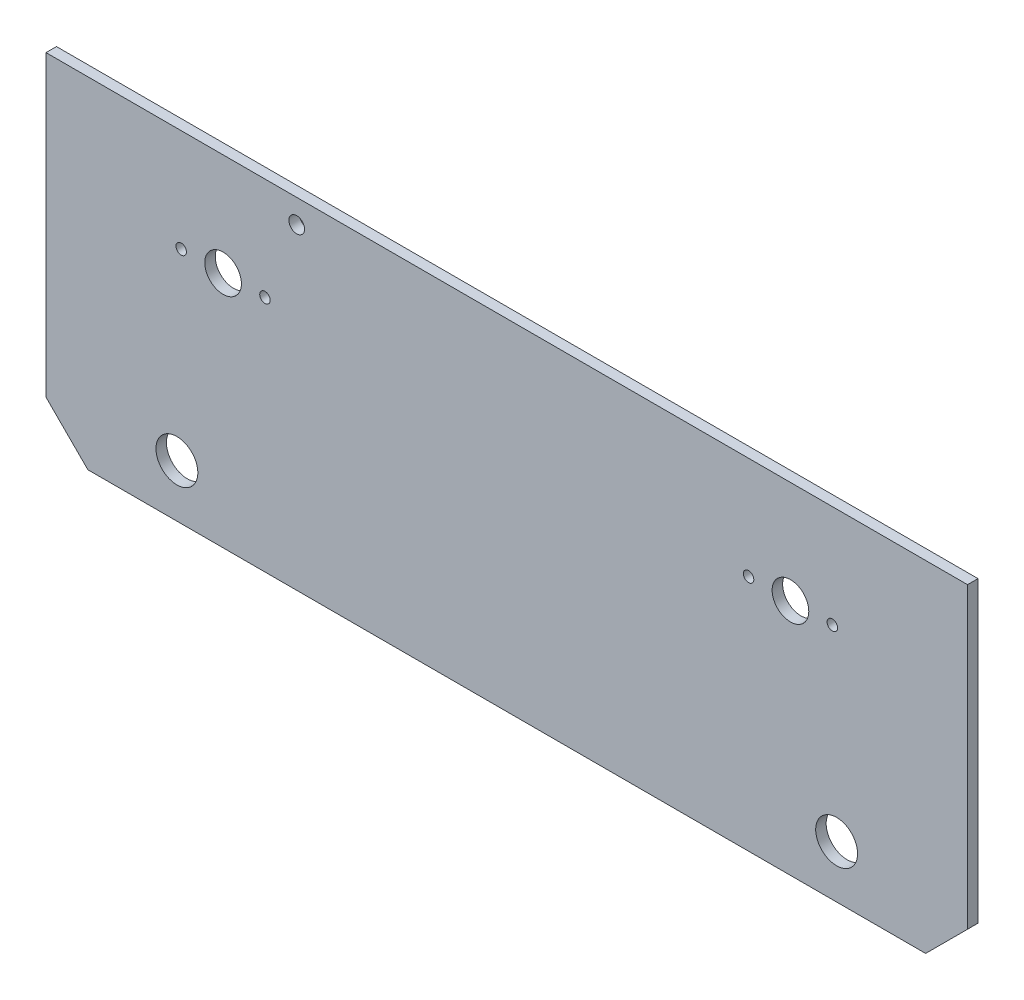
ISO-10303-21;
HEADER;
FILE_DESCRIPTION(('STEP AP214'),'2;1');
FILE_NAME('part.step','',(''),(''),'','','');
FILE_SCHEMA(('AUTOMOTIVE_DESIGN { 1 0 10303 214 1 1 1 1 }'));
ENDSEC;
DATA;
#1=APPLICATION_CONTEXT('core data for automotive mechanical design processes');
#2=APPLICATION_PROTOCOL_DEFINITION('international standard','automotive_design',2000,#1);
#3=PRODUCT_CONTEXT('',#1,'mechanical');
#4=PRODUCT('Part','Part','',(#3));
#5=PRODUCT_RELATED_PRODUCT_CATEGORY('part','',(#4));
#6=PRODUCT_DEFINITION_FORMATION('','',#4);
#7=PRODUCT_DEFINITION_CONTEXT('part definition',#1,'design');
#8=PRODUCT_DEFINITION('design','',#6,#7);
#9=PRODUCT_DEFINITION_SHAPE('','',#8);
#10=(LENGTH_UNIT() NAMED_UNIT(*) SI_UNIT(.MILLI.,.METRE.));
#11=(NAMED_UNIT(*) PLANE_ANGLE_UNIT() SI_UNIT($,.RADIAN.));
#12=(NAMED_UNIT(*) SI_UNIT($,.STERADIAN.) SOLID_ANGLE_UNIT());
#13=UNCERTAINTY_MEASURE_WITH_UNIT(LENGTH_MEASURE(1.E-05),#10,'distance_accuracy_value','');
#14=(GEOMETRIC_REPRESENTATION_CONTEXT(3) GLOBAL_UNCERTAINTY_ASSIGNED_CONTEXT((#13)) GLOBAL_UNIT_ASSIGNED_CONTEXT((#10,
#11,#12)) REPRESENTATION_CONTEXT('',''));
#15=CARTESIAN_POINT('',(0.,0.,0.));
#16=DIRECTION('',(0.,0.,1.));
#17=DIRECTION('',(1.,0.,0.));
#18=AXIS2_PLACEMENT_3D('',#15,#16,#17);
#19=CARTESIAN_POINT('',(40.11537857854,-145.444231825265,2.));
#20=DIRECTION('',(0.,0.,1.));
#21=DIRECTION('',(1.,0.,0.));
#22=AXIS2_PLACEMENT_3D('',#19,#20,#21);
#23=PLANE('',#22);
#24=CARTESIAN_POINT('',(0.,30.1478303680369,2.));
#25=DIRECTION('',(0.,0.,1.));
#26=DIRECTION('',(1.,0.,0.));
#27=AXIS2_PLACEMENT_3D('',#24,#25,#26);
#28=CIRCLE('',#27,1.5);
#29=CARTESIAN_POINT('',(1.5,30.1478303680369,2.));
#30=VERTEX_POINT('',#29);
#31=EDGE_CURVE('E179',#30,#30,#28,.T.);
#32=ORIENTED_EDGE('',*,*,#31,.F.);
#33=EDGE_LOOP('',(#32));
#34=FACE_BOUND('',#33,.T.);
#35=CARTESIAN_POINT('',(86.2953785785399,15.0982378333792,2.));
#36=DIRECTION('',(0.,0.,-1.));
#37=DIRECTION('',(-1.,0.,0.));
#38=AXIS2_PLACEMENT_3D('',#35,#36,#37);
#39=CIRCLE('',#38,0.999999999999985);
#40=CARTESIAN_POINT('',(85.2953785785399,15.0982378333792,2.));
#41=VERTEX_POINT('',#40);
#42=EDGE_CURVE('E159',#41,#41,#39,.T.);
#43=ORIENTED_EDGE('',*,*,#42,.T.);
#44=EDGE_LOOP('',(#43));
#45=FACE_BOUND('',#44,.T.);
#46=CARTESIAN_POINT('',(-6.06462142146009,15.0982378333792,2.));
#47=DIRECTION('',(0.,0.,1.));
#48=DIRECTION('',(1.,0.,0.));
#49=AXIS2_PLACEMENT_3D('',#46,#47,#48);
#50=CIRCLE('',#49,1.);
#51=CARTESIAN_POINT('',(-5.06462142146009,15.0982378333792,2.));
#52=VERTEX_POINT('',#51);
#53=EDGE_CURVE('E153',#52,#52,#50,.T.);
#54=ORIENTED_EDGE('',*,*,#53,.F.);
#55=EDGE_LOOP('',(#54));
#56=FACE_BOUND('',#55,.T.);
#57=CARTESIAN_POINT('',(-22.0646214214601,15.0982378333791,2.));
#58=DIRECTION('',(0.,0.,1.));
#59=DIRECTION('',(1.,0.,0.));
#60=AXIS2_PLACEMENT_3D('',#57,#58,#59);
#61=CIRCLE('',#60,1.);
#62=CARTESIAN_POINT('',(-21.0646214214601,15.0982378333791,2.));
#63=VERTEX_POINT('',#62);
#64=EDGE_CURVE('E147',#63,#63,#61,.T.);
#65=ORIENTED_EDGE('',*,*,#64,.F.);
#66=EDGE_LOOP('',(#65));
#67=FACE_BOUND('',#66,.T.);
#68=CARTESIAN_POINT('',(-14.0646214214601,15.0982378333792,2.));
#69=DIRECTION('',(0.,0.,1.));
#70=DIRECTION('',(1.,0.,0.));
#71=AXIS2_PLACEMENT_3D('',#68,#69,#70);
#72=CIRCLE('',#71,3.5);
#73=CARTESIAN_POINT('',(-10.5646214214601,15.0982378333792,2.));
#74=VERTEX_POINT('',#73);
#75=EDGE_CURVE('E144',#74,#74,#72,.T.);
#76=ORIENTED_EDGE('',*,*,#75,.F.);
#77=EDGE_LOOP('',(#76));
#78=FACE_BOUND('',#77,.T.);
#79=DIRECTION('',(-0.707106781186551,0.707106781186544,0.));
#80=VECTOR('',#79,1.);
#81=CARTESIAN_POINT('',(57.6759776372402,-127.883632766565,2.));
#82=LINE('',#81,#80);
#83=CARTESIAN_POINT('',(-39.8846214214601,-30.3230337078652,2.));
#84=VERTEX_POINT('',#83);
#85=CARTESIAN_POINT('',(-47.8846214214601,-22.3230337078653,2.));
#86=VERTEX_POINT('',#85);
#87=EDGE_CURVE('E125',#84,#86,#82,.T.);
#88=ORIENTED_EDGE('',*,*,#87,.F.);
#89=DIRECTION('',(1.,0.,0.));
#90=VECTOR('',#89,1.);
#91=CARTESIAN_POINT('',(40.11537857854,-30.3230337078652,2.));
#92=LINE('',#91,#90);
#93=CARTESIAN_POINT('',(120.11537857854,-30.3230337078652,2.));
#94=VERTEX_POINT('',#93);
#95=EDGE_CURVE('E140',#84,#94,#92,.T.);
#96=ORIENTED_EDGE('',*,*,#95,.T.);
#97=DIRECTION('',(0.70710678118655,0.707106781186545,0.));
#98=VECTOR('',#97,1.);
#99=CARTESIAN_POINT('',(22.5547795198397,-127.883632766565,2.));
#100=LINE('',#99,#98);
#101=CARTESIAN_POINT('',(128.11537857854,-22.3230337078652,2.));
#102=VERTEX_POINT('',#101);
#103=EDGE_CURVE('E91',#94,#102,#100,.T.);
#104=ORIENTED_EDGE('',*,*,#103,.T.);
#105=DIRECTION('',(0.,-1.,0.));
#106=VECTOR('',#105,1.);
#107=CARTESIAN_POINT('',(128.11537857854,-145.444231825265,2.));
#108=LINE('',#107,#106);
#109=CARTESIAN_POINT('',(128.11537857854,34.6769662921348,2.));
#110=VERTEX_POINT('',#109);
#111=EDGE_CURVE('E79',#110,#102,#108,.T.);
#112=ORIENTED_EDGE('',*,*,#111,.F.);
#113=DIRECTION('',(1.,0.,0.));
#114=VECTOR('',#113,1.);
#115=CARTESIAN_POINT('',(40.11537857854,34.6769662921348,2.));
#116=LINE('',#115,#114);
#117=CARTESIAN_POINT('',(-47.8846214214601,34.6769662921348,2.));
#118=VERTEX_POINT('',#117);
#119=EDGE_CURVE('E89',#118,#110,#116,.T.);
#120=ORIENTED_EDGE('',*,*,#119,.F.);
#121=DIRECTION('',(0.,-1.,0.));
#122=VECTOR('',#121,1.);
#123=CARTESIAN_POINT('',(-47.8846214214601,-145.444231825265,2.));
#124=LINE('',#123,#122);
#125=EDGE_CURVE('E34',#118,#86,#124,.T.);
#126=ORIENTED_EDGE('',*,*,#125,.T.);
#127=EDGE_LOOP('',(#88,#96,#104,#112,#120,#126));
#128=FACE_BOUND('',#127,.T.);
#129=CARTESIAN_POINT('',(-22.8846214214601,-20.3230337078652,2.));
#130=DIRECTION('',(0.,0.,1.));
#131=DIRECTION('',(1.,0.,0.));
#132=AXIS2_PLACEMENT_3D('',#129,#130,#131);
#133=CIRCLE('',#132,4.);
#134=CARTESIAN_POINT('',(-18.8846214214601,-20.3230337078652,2.));
#135=VERTEX_POINT('',#134);
#136=EDGE_CURVE('E96',#135,#135,#133,.T.);
#137=ORIENTED_EDGE('',*,*,#136,.F.);
#138=EDGE_LOOP('',(#137));
#139=FACE_BOUND('',#138,.T.);
#140=CARTESIAN_POINT('',(103.11537857854,-20.3230337078652,2.));
#141=DIRECTION('',(0.,0.,1.));
#142=DIRECTION('',(1.,0.,0.));
#143=AXIS2_PLACEMENT_3D('',#140,#141,#142);
#144=CIRCLE('',#143,4.);
#145=CARTESIAN_POINT('',(107.11537857854,-20.3230337078652,2.));
#146=VERTEX_POINT('',#145);
#147=EDGE_CURVE('E102',#146,#146,#144,.T.);
#148=ORIENTED_EDGE('',*,*,#147,.F.);
#149=EDGE_LOOP('',(#148));
#150=FACE_BOUND('',#149,.T.);
#151=CARTESIAN_POINT('',(94.29537857854,15.0982378333791,2.));
#152=DIRECTION('',(0.,0.,1.));
#153=DIRECTION('',(1.,0.,0.));
#154=AXIS2_PLACEMENT_3D('',#151,#152,#153);
#155=CIRCLE('',#154,3.5);
#156=CARTESIAN_POINT('',(97.79537857854,15.0982378333791,2.));
#157=VERTEX_POINT('',#156);
#158=EDGE_CURVE('E165',#157,#157,#155,.T.);
#159=ORIENTED_EDGE('',*,*,#158,.F.);
#160=EDGE_LOOP('',(#159));
#161=FACE_BOUND('',#160,.T.);
#162=CARTESIAN_POINT('',(102.29537857854,15.0982378333791,2.));
#163=DIRECTION('',(0.,0.,-1.));
#164=DIRECTION('',(-1.,0.,0.));
#165=AXIS2_PLACEMENT_3D('',#162,#163,#164);
#166=CIRCLE('',#165,1.00000000000001);
#167=CARTESIAN_POINT('',(101.29537857854,15.0982378333791,2.));
#168=VERTEX_POINT('',#167);
#169=EDGE_CURVE('E171',#168,#168,#166,.T.);
#170=ORIENTED_EDGE('',*,*,#169,.T.);
#171=EDGE_LOOP('',(#170));
#172=FACE_BOUND('',#171,.T.);
#173=ADVANCED_FACE('F16',(#34,#45,#56,#67,#78,#128,#139,#150,#161,#172),#23,.T.);
#174=CARTESIAN_POINT('',(40.11537857854,-145.444231825265,0.));
#175=DIRECTION('',(0.,0.,1.));
#176=DIRECTION('',(1.,0.,0.));
#177=AXIS2_PLACEMENT_3D('',#174,#175,#176);
#178=PLANE('',#177);
#179=CARTESIAN_POINT('',(0.,30.1478303680369,0.));
#180=DIRECTION('',(0.,0.,1.));
#181=DIRECTION('',(1.,0.,0.));
#182=AXIS2_PLACEMENT_3D('',#179,#180,#181);
#183=CIRCLE('',#182,1.5);
#184=CARTESIAN_POINT('',(1.5,30.1478303680369,0.));
#185=VERTEX_POINT('',#184);
#186=EDGE_CURVE('E20',#185,#185,#183,.T.);
#187=ORIENTED_EDGE('',*,*,#186,.T.);
#188=EDGE_LOOP('',(#187));
#189=FACE_BOUND('',#188,.T.);
#190=CARTESIAN_POINT('',(86.2953785785399,15.0982378333792,0.));
#191=DIRECTION('',(0.,0.,-1.));
#192=DIRECTION('',(-1.,0.,0.));
#193=AXIS2_PLACEMENT_3D('',#190,#191,#192);
#194=CIRCLE('',#193,0.999999999999985);
#195=CARTESIAN_POINT('',(85.2953785785399,15.0982378333792,0.));
#196=VERTEX_POINT('',#195);
#197=EDGE_CURVE('E162',#196,#196,#194,.T.);
#198=ORIENTED_EDGE('',*,*,#197,.F.);
#199=EDGE_LOOP('',(#198));
#200=FACE_BOUND('',#199,.T.);
#201=CARTESIAN_POINT('',(-6.06462142146009,15.0982378333792,0.));
#202=DIRECTION('',(0.,0.,1.));
#203=DIRECTION('',(1.,0.,0.));
#204=AXIS2_PLACEMENT_3D('',#201,#202,#203);
#205=CIRCLE('',#204,1.);
#206=CARTESIAN_POINT('',(-5.06462142146009,15.0982378333792,0.));
#207=VERTEX_POINT('',#206);
#208=EDGE_CURVE('E156',#207,#207,#205,.T.);
#209=ORIENTED_EDGE('',*,*,#208,.T.);
#210=EDGE_LOOP('',(#209));
#211=FACE_BOUND('',#210,.T.);
#212=CARTESIAN_POINT('',(-22.0646214214601,15.0982378333791,0.));
#213=DIRECTION('',(0.,0.,1.));
#214=DIRECTION('',(1.,0.,0.));
#215=AXIS2_PLACEMENT_3D('',#212,#213,#214);
#216=CIRCLE('',#215,1.);
#217=CARTESIAN_POINT('',(-21.0646214214601,15.0982378333791,0.));
#218=VERTEX_POINT('',#217);
#219=EDGE_CURVE('E150',#218,#218,#216,.T.);
#220=ORIENTED_EDGE('',*,*,#219,.T.);
#221=EDGE_LOOP('',(#220));
#222=FACE_BOUND('',#221,.T.);
#223=CARTESIAN_POINT('',(-14.0646214214601,15.0982378333792,0.));
#224=DIRECTION('',(0.,0.,1.));
#225=DIRECTION('',(1.,0.,0.));
#226=AXIS2_PLACEMENT_3D('',#223,#224,#225);
#227=CIRCLE('',#226,3.5);
#228=CARTESIAN_POINT('',(-10.5646214214601,15.0982378333792,0.));
#229=VERTEX_POINT('',#228);
#230=EDGE_CURVE('E109',#229,#229,#227,.T.);
#231=ORIENTED_EDGE('',*,*,#230,.T.);
#232=EDGE_LOOP('',(#231));
#233=FACE_BOUND('',#232,.T.);
#234=DIRECTION('',(-0.707106781186551,0.707106781186544,0.));
#235=VECTOR('',#234,1.);
#236=CARTESIAN_POINT('',(57.6759776372402,-127.883632766565,0.));
#237=LINE('',#236,#235);
#238=CARTESIAN_POINT('',(-39.8846214214601,-30.3230337078652,0.));
#239=VERTEX_POINT('',#238);
#240=CARTESIAN_POINT('',(-47.8846214214601,-22.3230337078653,0.));
#241=VERTEX_POINT('',#240);
#242=EDGE_CURVE('E105',#239,#241,#237,.T.);
#243=ORIENTED_EDGE('',*,*,#242,.T.);
#244=DIRECTION('',(0.,-1.,0.));
#245=VECTOR('',#244,1.);
#246=CARTESIAN_POINT('',(-47.8846214214601,-145.444231825265,0.));
#247=LINE('',#246,#245);
#248=CARTESIAN_POINT('',(-47.8846214214601,34.6769662921348,0.));
#249=VERTEX_POINT('',#248);
#250=EDGE_CURVE('E117',#249,#241,#247,.T.);
#251=ORIENTED_EDGE('',*,*,#250,.F.);
#252=DIRECTION('',(1.,0.,0.));
#253=VECTOR('',#252,1.);
#254=CARTESIAN_POINT('',(40.11537857854,34.6769662921348,0.));
#255=LINE('',#254,#253);
#256=CARTESIAN_POINT('',(128.11537857854,34.6769662921348,0.));
#257=VERTEX_POINT('',#256);
#258=EDGE_CURVE('E115',#249,#257,#255,.T.);
#259=ORIENTED_EDGE('',*,*,#258,.T.);
#260=DIRECTION('',(0.,-1.,0.));
#261=VECTOR('',#260,1.);
#262=CARTESIAN_POINT('',(128.11537857854,-145.444231825265,0.));
#263=LINE('',#262,#261);
#264=CARTESIAN_POINT('',(128.11537857854,-22.3230337078652,0.));
#265=VERTEX_POINT('',#264);
#266=EDGE_CURVE('E81',#257,#265,#263,.T.);
#267=ORIENTED_EDGE('',*,*,#266,.T.);
#268=DIRECTION('',(0.70710678118655,0.707106781186545,0.));
#269=VECTOR('',#268,1.);
#270=CARTESIAN_POINT('',(22.5547795198397,-127.883632766565,0.));
#271=LINE('',#270,#269);
#272=CARTESIAN_POINT('',(120.11537857854,-30.3230337078652,0.));
#273=VERTEX_POINT('',#272);
#274=EDGE_CURVE('E111',#273,#265,#271,.T.);
#275=ORIENTED_EDGE('',*,*,#274,.F.);
#276=DIRECTION('',(1.,0.,0.));
#277=VECTOR('',#276,1.);
#278=CARTESIAN_POINT('',(40.11537857854,-30.3230337078652,0.));
#279=LINE('',#278,#277);
#280=EDGE_CURVE('E108',#239,#273,#279,.T.);
#281=ORIENTED_EDGE('',*,*,#280,.F.);
#282=EDGE_LOOP('',(#243,#251,#259,#267,#275,#281));
#283=FACE_BOUND('',#282,.T.);
#284=CARTESIAN_POINT('',(-22.8846214214601,-20.3230337078652,0.));
#285=DIRECTION('',(0.,0.,1.));
#286=DIRECTION('',(1.,0.,0.));
#287=AXIS2_PLACEMENT_3D('',#284,#285,#286);
#288=CIRCLE('',#287,4.);
#289=CARTESIAN_POINT('',(-18.8846214214601,-20.3230337078652,0.));
#290=VERTEX_POINT('',#289);
#291=EDGE_CURVE('E119',#290,#290,#288,.T.);
#292=ORIENTED_EDGE('',*,*,#291,.T.);
#293=EDGE_LOOP('',(#292));
#294=FACE_BOUND('',#293,.T.);
#295=CARTESIAN_POINT('',(103.11537857854,-20.3230337078652,0.));
#296=DIRECTION('',(0.,0.,1.));
#297=DIRECTION('',(1.,0.,0.));
#298=AXIS2_PLACEMENT_3D('',#295,#296,#297);
#299=CIRCLE('',#298,4.);
#300=CARTESIAN_POINT('',(107.11537857854,-20.3230337078652,0.));
#301=VERTEX_POINT('',#300);
#302=EDGE_CURVE('E122',#301,#301,#299,.T.);
#303=ORIENTED_EDGE('',*,*,#302,.T.);
#304=EDGE_LOOP('',(#303));
#305=FACE_BOUND('',#304,.T.);
#306=CARTESIAN_POINT('',(94.29537857854,15.0982378333791,0.));
#307=DIRECTION('',(0.,0.,1.));
#308=DIRECTION('',(1.,0.,0.));
#309=AXIS2_PLACEMENT_3D('',#306,#307,#308);
#310=CIRCLE('',#309,3.5);
#311=CARTESIAN_POINT('',(97.79537857854,15.0982378333791,0.));
#312=VERTEX_POINT('',#311);
#313=EDGE_CURVE('E168',#312,#312,#310,.T.);
#314=ORIENTED_EDGE('',*,*,#313,.T.);
#315=EDGE_LOOP('',(#314));
#316=FACE_BOUND('',#315,.T.);
#317=CARTESIAN_POINT('',(102.29537857854,15.0982378333791,0.));
#318=DIRECTION('',(0.,0.,-1.));
#319=DIRECTION('',(-1.,0.,0.));
#320=AXIS2_PLACEMENT_3D('',#317,#318,#319);
#321=CIRCLE('',#320,1.00000000000001);
#322=CARTESIAN_POINT('',(101.29537857854,15.0982378333791,0.));
#323=VERTEX_POINT('',#322);
#324=EDGE_CURVE('E174',#323,#323,#321,.T.);
#325=ORIENTED_EDGE('',*,*,#324,.F.);
#326=EDGE_LOOP('',(#325));
#327=FACE_BOUND('',#326,.T.);
#328=ADVANCED_FACE('F137',(#189,#200,#211,#222,#233,#283,#294,#305,#316,#327),#178,.F.);
#329=CARTESIAN_POINT('',(57.6759776372402,-127.883632766565,2.));
#330=DIRECTION('',(-0.707106781186544,-0.707106781186551,0.));
#331=DIRECTION('',(0.707106781186551,-0.707106781186544,0.));
#332=AXIS2_PLACEMENT_3D('',#329,#330,#331);
#333=PLANE('',#332);
#334=ORIENTED_EDGE('',*,*,#242,.F.);
#335=DIRECTION('',(0.,0.,-1.));
#336=VECTOR('',#335,1.);
#337=CARTESIAN_POINT('',(-39.8846214214601,-30.3230337078652,2.));
#338=LINE('',#337,#336);
#339=EDGE_CURVE('E11',#84,#239,#338,.T.);
#340=ORIENTED_EDGE('',*,*,#339,.F.);
#341=ORIENTED_EDGE('',*,*,#87,.T.);
#342=DIRECTION('',(0.,0.,-1.));
#343=VECTOR('',#342,1.);
#344=CARTESIAN_POINT('',(-47.8846214214601,-22.3230337078653,2.));
#345=LINE('',#344,#343);
#346=EDGE_CURVE('E62',#86,#241,#345,.T.);
#347=ORIENTED_EDGE('',*,*,#346,.T.);
#348=EDGE_LOOP('',(#334,#340,#341,#347));
#349=FACE_BOUND('',#348,.T.);
#350=ADVANCED_FACE('F18',(#349),#333,.T.);
#351=CARTESIAN_POINT('',(40.11537857854,-30.3230337078652,2.));
#352=DIRECTION('',(0.,1.,0.));
#353=DIRECTION('',(0.,0.,1.));
#354=AXIS2_PLACEMENT_3D('',#351,#352,#353);
#355=PLANE('',#354);
#356=ORIENTED_EDGE('',*,*,#280,.T.);
#357=DIRECTION('',(0.,0.,-1.));
#358=VECTOR('',#357,1.);
#359=CARTESIAN_POINT('',(120.11537857854,-30.3230337078652,2.));
#360=LINE('',#359,#358);
#361=EDGE_CURVE('E26',#94,#273,#360,.T.);
#362=ORIENTED_EDGE('',*,*,#361,.F.);
#363=ORIENTED_EDGE('',*,*,#95,.F.);
#364=ORIENTED_EDGE('',*,*,#339,.T.);
#365=EDGE_LOOP('',(#356,#362,#363,#364));
#366=FACE_BOUND('',#365,.T.);
#367=ADVANCED_FACE('F229',(#366),#355,.F.);
#368=CARTESIAN_POINT('',(22.5547795198397,-127.883632766565,2.));
#369=DIRECTION('',(-0.707106781186545,0.70710678118655,0.));
#370=DIRECTION('',(-0.70710678118655,-0.707106781186545,0.));
#371=AXIS2_PLACEMENT_3D('',#368,#369,#370);
#372=PLANE('',#371);
#373=ORIENTED_EDGE('',*,*,#274,.T.);
#374=DIRECTION('',(0.,0.,-1.));
#375=VECTOR('',#374,1.);
#376=CARTESIAN_POINT('',(128.11537857854,-22.3230337078652,2.));
#377=LINE('',#376,#375);
#378=EDGE_CURVE('E86',#102,#265,#377,.T.);
#379=ORIENTED_EDGE('',*,*,#378,.F.);
#380=ORIENTED_EDGE('',*,*,#103,.F.);
#381=ORIENTED_EDGE('',*,*,#361,.T.);
#382=EDGE_LOOP('',(#373,#379,#380,#381));
#383=FACE_BOUND('',#382,.T.);
#384=ADVANCED_FACE('F133',(#383),#372,.F.);
#385=CARTESIAN_POINT('',(128.11537857854,-145.444231825265,2.));
#386=DIRECTION('',(1.,0.,0.));
#387=DIRECTION('',(0.,1.,0.));
#388=AXIS2_PLACEMENT_3D('',#385,#386,#387);
#389=PLANE('',#388);
#390=ORIENTED_EDGE('',*,*,#266,.F.);
#391=DIRECTION('',(0.,0.,-1.));
#392=VECTOR('',#391,1.);
#393=CARTESIAN_POINT('',(128.11537857854,34.6769662921348,2.));
#394=LINE('',#393,#392);
#395=EDGE_CURVE('E76',#110,#257,#394,.T.);
#396=ORIENTED_EDGE('',*,*,#395,.F.);
#397=ORIENTED_EDGE('',*,*,#111,.T.);
#398=ORIENTED_EDGE('',*,*,#378,.T.);
#399=EDGE_LOOP('',(#390,#396,#397,#398));
#400=FACE_BOUND('',#399,.T.);
#401=ADVANCED_FACE('F78',(#400),#389,.T.);
#402=CARTESIAN_POINT('',(40.11537857854,34.6769662921348,2.));
#403=DIRECTION('',(0.,1.,0.));
#404=DIRECTION('',(0.,0.,1.));
#405=AXIS2_PLACEMENT_3D('',#402,#403,#404);
#406=PLANE('',#405);
#407=ORIENTED_EDGE('',*,*,#258,.F.);
#408=DIRECTION('',(0.,0.,-1.));
#409=VECTOR('',#408,1.);
#410=CARTESIAN_POINT('',(-47.8846214214601,34.6769662921348,2.));
#411=LINE('',#410,#409);
#412=EDGE_CURVE('E55',#118,#249,#411,.T.);
#413=ORIENTED_EDGE('',*,*,#412,.F.);
#414=ORIENTED_EDGE('',*,*,#119,.T.);
#415=ORIENTED_EDGE('',*,*,#395,.T.);
#416=EDGE_LOOP('',(#407,#413,#414,#415));
#417=FACE_BOUND('',#416,.T.);
#418=ADVANCED_FACE('F94',(#417),#406,.T.);
#419=CARTESIAN_POINT('',(-22.8846214214601,-20.3230337078652,2.));
#420=DIRECTION('',(0.,0.,-1.));
#421=DIRECTION('',(-1.,0.,0.));
#422=AXIS2_PLACEMENT_3D('',#419,#420,#421);
#423=CYLINDRICAL_SURFACE('',#422,4.);
#424=ORIENTED_EDGE('',*,*,#136,.T.);
#425=EDGE_LOOP('',(#424));
#426=FACE_BOUND('',#425,.T.);
#427=ORIENTED_EDGE('',*,*,#291,.F.);
#428=EDGE_LOOP('',(#427));
#429=FACE_BOUND('',#428,.T.);
#430=ADVANCED_FACE('F218',(#426,#429),#423,.F.);
#431=CARTESIAN_POINT('',(-47.8846214214601,-145.444231825265,2.));
#432=DIRECTION('',(1.,0.,0.));
#433=DIRECTION('',(0.,1.,0.));
#434=AXIS2_PLACEMENT_3D('',#431,#432,#433);
#435=PLANE('',#434);
#436=ORIENTED_EDGE('',*,*,#250,.T.);
#437=ORIENTED_EDGE('',*,*,#346,.F.);
#438=ORIENTED_EDGE('',*,*,#125,.F.);
#439=ORIENTED_EDGE('',*,*,#412,.T.);
#440=EDGE_LOOP('',(#436,#437,#438,#439));
#441=FACE_BOUND('',#440,.T.);
#442=ADVANCED_FACE('F139',(#441),#435,.F.);
#443=CARTESIAN_POINT('',(103.11537857854,-20.3230337078652,2.));
#444=DIRECTION('',(0.,0.,-1.));
#445=DIRECTION('',(-1.,0.,0.));
#446=AXIS2_PLACEMENT_3D('',#443,#444,#445);
#447=CYLINDRICAL_SURFACE('',#446,4.);
#448=ORIENTED_EDGE('',*,*,#147,.T.);
#449=EDGE_LOOP('',(#448));
#450=FACE_BOUND('',#449,.T.);
#451=ORIENTED_EDGE('',*,*,#302,.F.);
#452=EDGE_LOOP('',(#451));
#453=FACE_BOUND('',#452,.T.);
#454=ADVANCED_FACE('F214',(#450,#453),#447,.F.);
#455=CARTESIAN_POINT('',(-14.0646214214601,15.0982378333792,0.));
#456=DIRECTION('',(0.,0.,1.));
#457=DIRECTION('',(1.,0.,0.));
#458=AXIS2_PLACEMENT_3D('',#455,#456,#457);
#459=CYLINDRICAL_SURFACE('',#458,3.5);
#460=ORIENTED_EDGE('',*,*,#230,.F.);
#461=EDGE_LOOP('',(#460));
#462=FACE_BOUND('',#461,.T.);
#463=ORIENTED_EDGE('',*,*,#75,.T.);
#464=EDGE_LOOP('',(#463));
#465=FACE_BOUND('',#464,.T.);
#466=ADVANCED_FACE('F211',(#462,#465),#459,.F.);
#467=CARTESIAN_POINT('',(-22.0646214214601,15.0982378333791,0.));
#468=DIRECTION('',(0.,0.,1.));
#469=DIRECTION('',(1.,0.,0.));
#470=AXIS2_PLACEMENT_3D('',#467,#468,#469);
#471=CYLINDRICAL_SURFACE('',#470,1.);
#472=ORIENTED_EDGE('',*,*,#219,.F.);
#473=EDGE_LOOP('',(#472));
#474=FACE_BOUND('',#473,.T.);
#475=ORIENTED_EDGE('',*,*,#64,.T.);
#476=EDGE_LOOP('',(#475));
#477=FACE_BOUND('',#476,.T.);
#478=ADVANCED_FACE('F296',(#474,#477),#471,.F.);
#479=CARTESIAN_POINT('',(-6.06462142146009,15.0982378333792,0.));
#480=DIRECTION('',(0.,0.,1.));
#481=DIRECTION('',(1.,0.,0.));
#482=AXIS2_PLACEMENT_3D('',#479,#480,#481);
#483=CYLINDRICAL_SURFACE('',#482,1.);
#484=ORIENTED_EDGE('',*,*,#208,.F.);
#485=EDGE_LOOP('',(#484));
#486=FACE_BOUND('',#485,.T.);
#487=ORIENTED_EDGE('',*,*,#53,.T.);
#488=EDGE_LOOP('',(#487));
#489=FACE_BOUND('',#488,.T.);
#490=ADVANCED_FACE('F303',(#486,#489),#483,.F.);
#491=CARTESIAN_POINT('',(86.2953785785399,15.0982378333792,0.));
#492=DIRECTION('',(0.,0.,1.));
#493=DIRECTION('',(1.,0.,0.));
#494=AXIS2_PLACEMENT_3D('',#491,#492,#493);
#495=CYLINDRICAL_SURFACE('',#494,0.999999999999985);
#496=ORIENTED_EDGE('',*,*,#197,.T.);
#497=EDGE_LOOP('',(#496));
#498=FACE_BOUND('',#497,.T.);
#499=ORIENTED_EDGE('',*,*,#42,.F.);
#500=EDGE_LOOP('',(#499));
#501=FACE_BOUND('',#500,.T.);
#502=ADVANCED_FACE('F310',(#498,#501),#495,.F.);
#503=CARTESIAN_POINT('',(94.29537857854,15.0982378333791,0.));
#504=DIRECTION('',(0.,0.,1.));
#505=DIRECTION('',(1.,0.,0.));
#506=AXIS2_PLACEMENT_3D('',#503,#504,#505);
#507=CYLINDRICAL_SURFACE('',#506,3.5);
#508=ORIENTED_EDGE('',*,*,#313,.F.);
#509=EDGE_LOOP('',(#508));
#510=FACE_BOUND('',#509,.T.);
#511=ORIENTED_EDGE('',*,*,#158,.T.);
#512=EDGE_LOOP('',(#511));
#513=FACE_BOUND('',#512,.T.);
#514=ADVANCED_FACE('F197',(#510,#513),#507,.F.);
#515=CARTESIAN_POINT('',(102.29537857854,15.0982378333791,0.));
#516=DIRECTION('',(0.,0.,1.));
#517=DIRECTION('',(1.,0.,0.));
#518=AXIS2_PLACEMENT_3D('',#515,#516,#517);
#519=CYLINDRICAL_SURFACE('',#518,1.00000000000001);
#520=ORIENTED_EDGE('',*,*,#324,.T.);
#521=EDGE_LOOP('',(#520));
#522=FACE_BOUND('',#521,.T.);
#523=ORIENTED_EDGE('',*,*,#169,.F.);
#524=EDGE_LOOP('',(#523));
#525=FACE_BOUND('',#524,.T.);
#526=ADVANCED_FACE('F190',(#522,#525),#519,.F.);
#527=CARTESIAN_POINT('',(0.,30.1478303680369,-1.));
#528=DIRECTION('',(0.,0.,1.));
#529=DIRECTION('',(1.,0.,0.));
#530=AXIS2_PLACEMENT_3D('',#527,#528,#529);
#531=CYLINDRICAL_SURFACE('',#530,1.5);
#532=ORIENTED_EDGE('',*,*,#31,.T.);
#533=EDGE_LOOP('',(#532));
#534=FACE_BOUND('',#533,.T.);
#535=ORIENTED_EDGE('',*,*,#186,.F.);
#536=EDGE_LOOP('',(#535));
#537=FACE_BOUND('',#536,.T.);
#538=ADVANCED_FACE('F188',(#534,#537),#531,.F.);
#539=CLOSED_SHELL('',(#173,#328,#350,#367,#384,#401,#418,#430,#442,#454,#466,#478,#490,#502,
#514,#526,#538));
#540=MANIFOLD_SOLID_BREP('B1',#539);
#541=ADVANCED_BREP_SHAPE_REPRESENTATION('',(#18,#540),#14);
#542=SHAPE_DEFINITION_REPRESENTATION(#9,#541);
ENDSEC;
END-ISO-10303-21;
